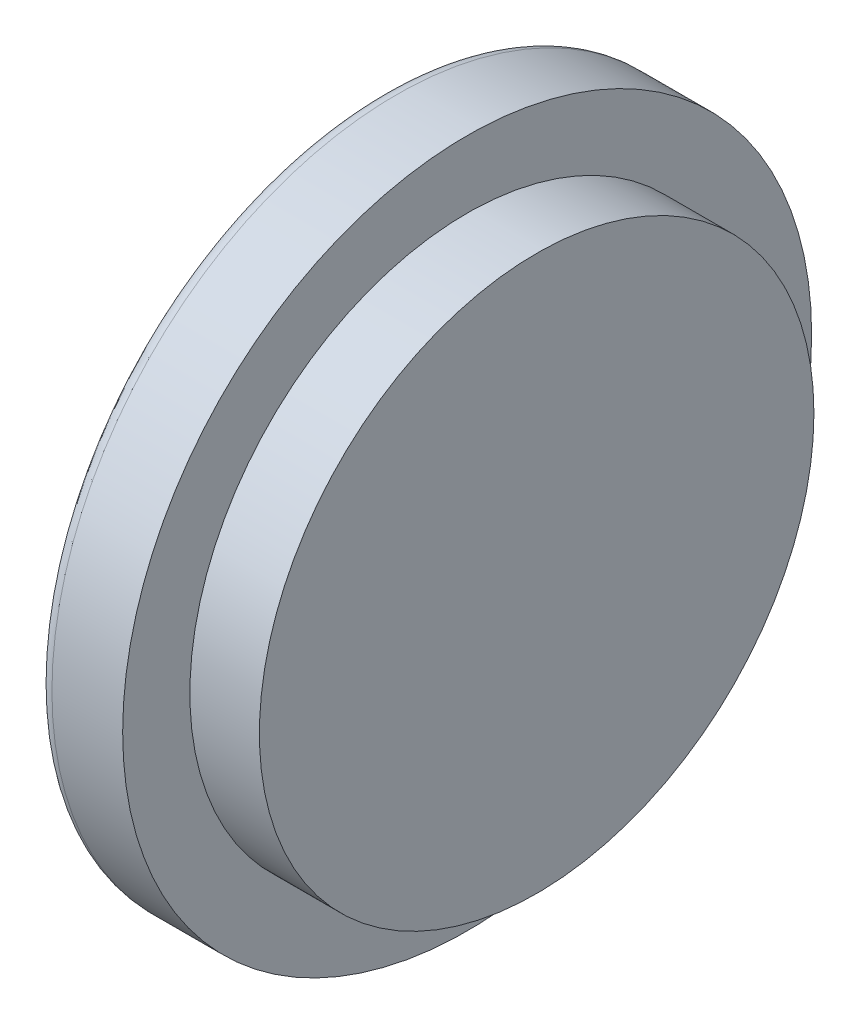
ISO-10303-21;
HEADER;
FILE_DESCRIPTION(('STEP AP214'),'2;1');
FILE_NAME('part.step','',(''),(''),'','','');
FILE_SCHEMA(('AUTOMOTIVE_DESIGN { 1 0 10303 214 1 1 1 1 }'));
ENDSEC;
DATA;
#1=APPLICATION_CONTEXT('core data for automotive mechanical design processes');
#2=APPLICATION_PROTOCOL_DEFINITION('international standard','automotive_design',2000,#1);
#3=PRODUCT_CONTEXT('',#1,'mechanical');
#4=PRODUCT('Part','Part','',(#3));
#5=PRODUCT_RELATED_PRODUCT_CATEGORY('part','',(#4));
#6=PRODUCT_DEFINITION_FORMATION('','',#4);
#7=PRODUCT_DEFINITION_CONTEXT('part definition',#1,'design');
#8=PRODUCT_DEFINITION('design','',#6,#7);
#9=PRODUCT_DEFINITION_SHAPE('','',#8);
#10=(LENGTH_UNIT() NAMED_UNIT(*) SI_UNIT(.MILLI.,.METRE.));
#11=(NAMED_UNIT(*) PLANE_ANGLE_UNIT() SI_UNIT($,.RADIAN.));
#12=(NAMED_UNIT(*) SI_UNIT($,.STERADIAN.) SOLID_ANGLE_UNIT());
#13=UNCERTAINTY_MEASURE_WITH_UNIT(LENGTH_MEASURE(1.E-05),#10,'distance_accuracy_value','');
#14=(GEOMETRIC_REPRESENTATION_CONTEXT(3) GLOBAL_UNCERTAINTY_ASSIGNED_CONTEXT((#13)) GLOBAL_UNIT_ASSIGNED_CONTEXT((#10,
#11,#12)) REPRESENTATION_CONTEXT('',''));
#15=CARTESIAN_POINT('',(0.,0.,0.));
#16=DIRECTION('',(0.,0.,1.));
#17=DIRECTION('',(1.,0.,0.));
#18=AXIS2_PLACEMENT_3D('',#15,#16,#17);
#19=CARTESIAN_POINT('',(38.1,0.,0.));
#20=DIRECTION('',(-1.,0.,0.));
#21=DIRECTION('',(0.,0.,1.));
#22=AXIS2_PLACEMENT_3D('',#19,#20,#21);
#23=CYLINDRICAL_SURFACE('',#22,154.626985005);
#24=CARTESIAN_POINT('',(6.35,0.,0.));
#25=DIRECTION('',(1.,0.,0.));
#26=DIRECTION('',(0.,0.,-1.));
#27=AXIS2_PLACEMENT_3D('',#24,#25,#26);
#28=CIRCLE('',#27,154.626985005);
#29=CARTESIAN_POINT('',(6.34999999999999,0.,154.626985005));
#30=VERTEX_POINT('',#29);
#31=EDGE_CURVE('E43',#30,#30,#28,.T.);
#32=CARTESIAN_POINT('',(38.1,0.,0.));
#33=DIRECTION('',(1.,0.,0.));
#34=DIRECTION('',(0.,0.,-1.));
#35=AXIS2_PLACEMENT_3D('',#32,#33,#34);
#36=CIRCLE('',#35,154.626985005);
#37=CARTESIAN_POINT('',(38.1,0.,154.626985005));
#38=VERTEX_POINT('',#37);
#39=EDGE_CURVE('E50',#38,#38,#36,.T.);
#40=CARTESIAN_POINT('',(6.34999999999999,0.,154.626985005));
#41=CARTESIAN_POINT('',(6.68072916666666,0.,154.626985005));
#42=CARTESIAN_POINT('',(7.01145833333333,0.,154.626985005));
#43=CARTESIAN_POINT('',(7.67291666666666,0.,154.626985005));
#44=CARTESIAN_POINT('',(8.00364583333332,0.,154.626985005));
#45=CARTESIAN_POINT('',(8.66510416666666,0.,154.626985005));
#46=CARTESIAN_POINT('',(8.99583333333333,0.,154.626985005));
#47=CARTESIAN_POINT('',(9.65729166666666,0.,154.626985005));
#48=CARTESIAN_POINT('',(9.98802083333332,0.,154.626985005));
#49=CARTESIAN_POINT('',(10.6494791666667,0.,154.626985005));
#50=CARTESIAN_POINT('',(10.9802083333333,0.,154.626985005));
#51=CARTESIAN_POINT('',(11.6416666666667,0.,154.626985005));
#52=CARTESIAN_POINT('',(11.9723958333333,0.,154.626985005));
#53=CARTESIAN_POINT('',(12.6338541666667,0.,154.626985005));
#54=CARTESIAN_POINT('',(12.9645833333333,0.,154.626985005));
#55=CARTESIAN_POINT('',(13.6260416666667,0.,154.626985005));
#56=CARTESIAN_POINT('',(13.9567708333333,0.,154.626985005));
#57=CARTESIAN_POINT('',(14.6182291666667,0.,154.626985005));
#58=CARTESIAN_POINT('',(14.9489583333333,0.,154.626985005));
#59=CARTESIAN_POINT('',(15.6104166666667,0.,154.626985005));
#60=CARTESIAN_POINT('',(15.9411458333333,0.,154.626985005));
#61=CARTESIAN_POINT('',(16.6026041666667,0.,154.626985005));
#62=CARTESIAN_POINT('',(16.9333333333333,0.,154.626985005));
#63=CARTESIAN_POINT('',(17.5947916666667,0.,154.626985005));
#64=CARTESIAN_POINT('',(17.9255208333333,0.,154.626985005));
#65=CARTESIAN_POINT('',(18.5869791666667,0.,154.626985005));
#66=CARTESIAN_POINT('',(18.9177083333333,0.,154.626985005));
#67=CARTESIAN_POINT('',(19.5791666666667,0.,154.626985005));
#68=CARTESIAN_POINT('',(19.9098958333333,0.,154.626985005));
#69=CARTESIAN_POINT('',(20.5713541666667,0.,154.626985005));
#70=CARTESIAN_POINT('',(20.9020833333333,0.,154.626985005));
#71=CARTESIAN_POINT('',(21.5635416666667,0.,154.626985005));
#72=CARTESIAN_POINT('',(21.8942708333333,0.,154.626985005));
#73=CARTESIAN_POINT('',(22.5557291666667,0.,154.626985005));
#74=CARTESIAN_POINT('',(22.8864583333333,0.,154.626985005));
#75=CARTESIAN_POINT('',(23.5479166666667,0.,154.626985005));
#76=CARTESIAN_POINT('',(23.8786458333333,0.,154.626985005));
#77=CARTESIAN_POINT('',(24.5401041666667,0.,154.626985005));
#78=CARTESIAN_POINT('',(24.8708333333333,0.,154.626985005));
#79=CARTESIAN_POINT('',(25.5322916666667,0.,154.626985005));
#80=CARTESIAN_POINT('',(25.8630208333333,0.,154.626985005));
#81=CARTESIAN_POINT('',(26.5244791666667,0.,154.626985005));
#82=CARTESIAN_POINT('',(26.8552083333333,0.,154.626985005));
#83=CARTESIAN_POINT('',(27.5166666666667,0.,154.626985005));
#84=CARTESIAN_POINT('',(27.8473958333333,0.,154.626985005));
#85=CARTESIAN_POINT('',(28.5088541666667,0.,154.626985005));
#86=CARTESIAN_POINT('',(28.8395833333333,0.,154.626985005));
#87=CARTESIAN_POINT('',(29.5010416666667,0.,154.626985005));
#88=CARTESIAN_POINT('',(29.8317708333333,0.,154.626985005));
#89=CARTESIAN_POINT('',(30.4932291666667,0.,154.626985005));
#90=CARTESIAN_POINT('',(30.8239583333333,0.,154.626985005));
#91=CARTESIAN_POINT('',(31.4854166666667,0.,154.626985005));
#92=CARTESIAN_POINT('',(31.8161458333333,0.,154.626985005));
#93=CARTESIAN_POINT('',(32.4776041666667,0.,154.626985005));
#94=CARTESIAN_POINT('',(32.8083333333333,0.,154.626985005));
#95=CARTESIAN_POINT('',(33.4697916666667,0.,154.626985005));
#96=CARTESIAN_POINT('',(33.8005208333333,0.,154.626985005));
#97=CARTESIAN_POINT('',(34.4619791666667,0.,154.626985005));
#98=CARTESIAN_POINT('',(34.7927083333333,0.,154.626985005));
#99=CARTESIAN_POINT('',(35.4541666666667,0.,154.626985005));
#100=CARTESIAN_POINT('',(35.7848958333333,0.,154.626985005));
#101=CARTESIAN_POINT('',(36.4463541666667,0.,154.626985005));
#102=CARTESIAN_POINT('',(36.7770833333333,0.,154.626985005));
#103=CARTESIAN_POINT('',(37.4385416666667,0.,154.626985005));
#104=CARTESIAN_POINT('',(37.7692708333333,0.,154.626985005));
#105=CARTESIAN_POINT('',(38.1,0.,154.626985005));
#106=B_SPLINE_CURVE_WITH_KNOTS('',3,(#40,#41,#42,#43,#44,#45,#46,#47,#48,#49,#50,#51,#52,#53,
#54,#55,#56,#57,#58,#59,#60,#61,#62,#63,#64,#65,#66,#67,#68,#69,#70,#71,#72,#73,#74,#75,#76,#77,
#78,#79,#80,#81,#82,#83,#84,#85,#86,#87,#88,#89,#90,#91,#92,#93,#94,#95,#96,#97,#98,#99,#100,
#101,#102,#103,#104,#105),.UNSPECIFIED.,.F.,.F.,(4,2,2,2,2,2,2,2,2,2,2,2,2,2,2,2,2,2,2,2,2,2,2,
2,2,2,2,2,2,2,2,2,4),(0.,0.992187499999998,1.984375,2.9765625,3.96875,4.9609375,5.953125,
6.9453125,7.9375,8.9296875,9.921875,10.9140625,11.90625,12.8984375,13.890625,14.8828125,15.875,
16.8671875,17.859375,18.8515625,19.84375,20.8359375,21.828125,22.8203125,23.8125,24.8046875,
25.796875,26.7890625,27.78125,28.7734375,29.765625,30.7578125,31.75),.UNSPECIFIED.);
#107=EDGE_CURVE('BSEAM38',#30,#38,#106,.T.);
#108=ORIENTED_EDGE('',*,*,#31,.T.);
#109=ORIENTED_EDGE('',*,*,#39,.F.);
#110=ORIENTED_EDGE('',*,*,#107,.T.);
#111=ORIENTED_EDGE('',*,*,#107,.F.);
#112=EDGE_LOOP('',(#108,#110,#109,#111));
#113=FACE_BOUND('',#112,.T.);
#114=ADVANCED_FACE('F38',(#113),#23,.T.);
#115=CARTESIAN_POINT('',(38.1,0.,0.));
#116=DIRECTION('',(1.,0.,0.));
#117=DIRECTION('',(0.,0.,-1.));
#118=AXIS2_PLACEMENT_3D('',#115,#116,#117);
#119=PLANE('',#118);
#120=CARTESIAN_POINT('',(38.1,0.,0.));
#121=DIRECTION('',(1.,0.,0.));
#122=DIRECTION('',(0.,0.,-1.));
#123=AXIS2_PLACEMENT_3D('',#120,#121,#122);
#124=CIRCLE('',#123,124.46);
#125=CARTESIAN_POINT('',(38.1,0.,-124.46));
#126=VERTEX_POINT('',#125);
#127=EDGE_CURVE('E51',#126,#126,#124,.F.);
#128=ORIENTED_EDGE('',*,*,#127,.T.);
#129=EDGE_LOOP('',(#128));
#130=FACE_BOUND('',#129,.T.);
#131=ORIENTED_EDGE('',*,*,#39,.T.);
#132=EDGE_LOOP('',(#131));
#133=FACE_BOUND('',#132,.T.);
#134=ADVANCED_FACE('F77',(#130,#133),#119,.T.);
#135=CARTESIAN_POINT('',(0.,0.,0.));
#136=DIRECTION('',(1.,0.,0.));
#137=DIRECTION('',(0.,0.,-1.));
#138=AXIS2_PLACEMENT_3D('',#135,#136,#137);
#139=PLANE('',#138);
#140=CARTESIAN_POINT('',(0.,0.,0.));
#141=DIRECTION('',(1.,0.,0.));
#142=DIRECTION('',(0.,0.,-1.));
#143=AXIS2_PLACEMENT_3D('',#140,#141,#142);
#144=CIRCLE('',#143,148.276985005);
#145=CARTESIAN_POINT('',(0.,0.,-148.276985005));
#146=VERTEX_POINT('',#145);
#147=EDGE_CURVE('E10',#146,#146,#144,.F.);
#148=ORIENTED_EDGE('',*,*,#147,.T.);
#149=EDGE_LOOP('',(#148));
#150=FACE_BOUND('',#149,.T.);
#151=CARTESIAN_POINT('',(0.,0.,0.));
#152=DIRECTION('',(-1.,0.,0.));
#153=DIRECTION('',(0.,0.,1.));
#154=AXIS2_PLACEMENT_3D('',#151,#152,#153);
#155=CIRCLE('',#154,139.7);
#156=CARTESIAN_POINT('',(0.,0.,139.7));
#157=VERTEX_POINT('',#156);
#158=EDGE_CURVE('E58',#157,#157,#155,.T.);
#159=ORIENTED_EDGE('',*,*,#158,.F.);
#160=EDGE_LOOP('',(#159));
#161=FACE_BOUND('',#160,.T.);
#162=ADVANCED_FACE('F73',(#150,#161),#139,.F.);
#163=CARTESIAN_POINT('',(69.3,0.,0.));
#164=DIRECTION('',(-1.,0.,0.));
#165=DIRECTION('',(0.,0.,1.));
#166=AXIS2_PLACEMENT_3D('',#163,#164,#165);
#167=CYLINDRICAL_SURFACE('',#166,124.46);
#168=ORIENTED_EDGE('',*,*,#127,.F.);
#169=EDGE_LOOP('',(#168));
#170=FACE_BOUND('',#169,.T.);
#171=CARTESIAN_POINT('',(69.3,0.,0.));
#172=DIRECTION('',(1.,0.,0.));
#173=DIRECTION('',(0.,0.,-1.));
#174=AXIS2_PLACEMENT_3D('',#171,#172,#173);
#175=CIRCLE('',#174,124.46);
#176=CARTESIAN_POINT('',(69.3,0.,-124.46));
#177=VERTEX_POINT('',#176);
#178=EDGE_CURVE('E57',#177,#177,#175,.T.);
#179=ORIENTED_EDGE('',*,*,#178,.F.);
#180=EDGE_LOOP('',(#179));
#181=FACE_BOUND('',#180,.T.);
#182=ADVANCED_FACE('F80',(#170,#181),#167,.T.);
#183=CARTESIAN_POINT('',(69.3,0.,0.));
#184=DIRECTION('',(1.,0.,0.));
#185=DIRECTION('',(0.,0.,-1.));
#186=AXIS2_PLACEMENT_3D('',#183,#184,#185);
#187=PLANE('',#186);
#188=ORIENTED_EDGE('',*,*,#178,.T.);
#189=EDGE_LOOP('',(#188));
#190=FACE_BOUND('',#189,.T.);
#191=ADVANCED_FACE('F72',(#190),#187,.T.);
#192=CARTESIAN_POINT('',(6.35,0.,0.));
#193=DIRECTION('',(-1.,0.,0.));
#194=DIRECTION('',(0.,0.,1.));
#195=AXIS2_PLACEMENT_3D('',#192,#193,#194);
#196=CYLINDRICAL_SURFACE('',#195,139.7);
#197=CARTESIAN_POINT('',(6.35,0.,0.));
#198=DIRECTION('',(-1.,0.,0.));
#199=DIRECTION('',(0.,0.,1.));
#200=AXIS2_PLACEMENT_3D('',#197,#198,#199);
#201=CIRCLE('',#200,139.7);
#202=CARTESIAN_POINT('',(6.35,0.,139.7));
#203=VERTEX_POINT('',#202);
#204=EDGE_CURVE('E56',#203,#203,#201,.T.);
#205=ORIENTED_EDGE('',*,*,#204,.F.);
#206=EDGE_LOOP('',(#205));
#207=FACE_BOUND('',#206,.T.);
#208=ORIENTED_EDGE('',*,*,#158,.T.);
#209=EDGE_LOOP('',(#208));
#210=FACE_BOUND('',#209,.T.);
#211=ADVANCED_FACE('F67',(#207,#210),#196,.F.);
#212=CARTESIAN_POINT('',(6.35,0.,0.));
#213=DIRECTION('',(-1.,0.,0.));
#214=DIRECTION('',(0.,0.,1.));
#215=AXIS2_PLACEMENT_3D('',#212,#213,#214);
#216=PLANE('',#215);
#217=ORIENTED_EDGE('',*,*,#204,.T.);
#218=EDGE_LOOP('',(#217));
#219=FACE_BOUND('',#218,.T.);
#220=ADVANCED_FACE('F66',(#219),#216,.T.);
#221=CARTESIAN_POINT('',(6.35,0.,0.));
#222=DIRECTION('',(1.,0.,0.));
#223=DIRECTION('',(0.,0.,-1.));
#224=AXIS2_PLACEMENT_3D('',#221,#222,#223);
#225=TOROIDAL_SURFACE('',#224,148.276985005,6.35);
#226=ORIENTED_EDGE('',*,*,#147,.F.);
#227=EDGE_LOOP('',(#226));
#228=FACE_BOUND('',#227,.T.);
#229=ORIENTED_EDGE('',*,*,#31,.F.);
#230=EDGE_LOOP('',(#229));
#231=FACE_BOUND('',#230,.T.);
#232=ADVANCED_FACE('F36',(#228,#231),#225,.T.);
#233=CLOSED_SHELL('',(#114,#134,#162,#182,#191,#211,#220,#232));
#234=MANIFOLD_SOLID_BREP('B2',#233);
#235=ADVANCED_BREP_SHAPE_REPRESENTATION('',(#18,#234),#14);
#236=SHAPE_DEFINITION_REPRESENTATION(#9,#235);
ENDSEC;
END-ISO-10303-21;
